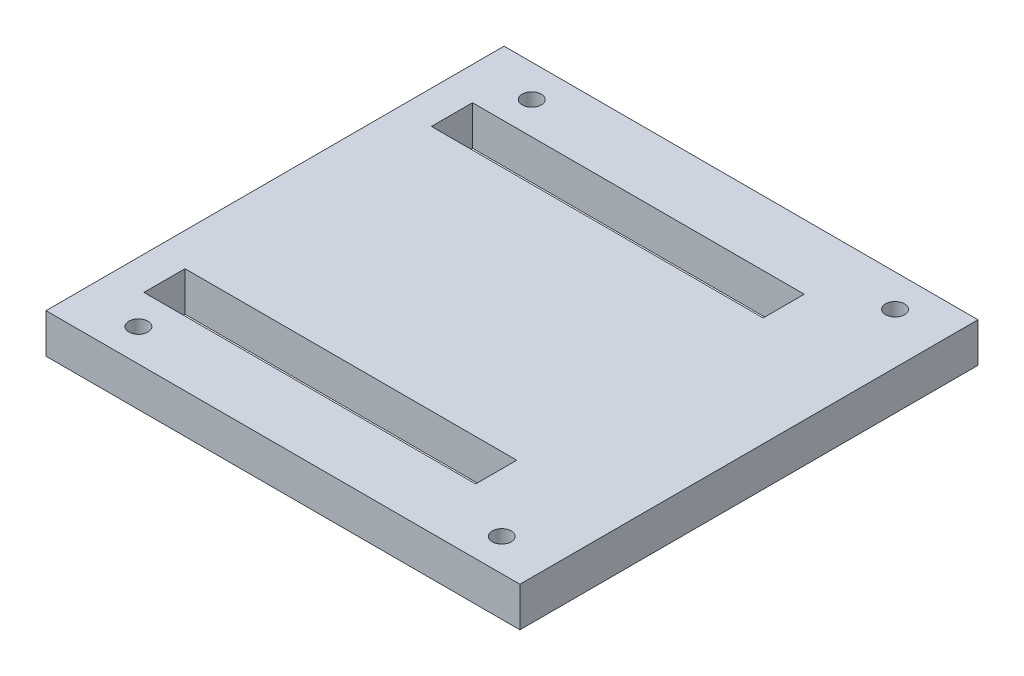
ISO-10303-21;
HEADER;
FILE_DESCRIPTION(('STEP AP214'),'2;1');
FILE_NAME('part.step','',(''),(''),'','','');
FILE_SCHEMA(('AUTOMOTIVE_DESIGN { 1 0 10303 214 1 1 1 1 }'));
ENDSEC;
DATA;
#1=APPLICATION_CONTEXT('core data for automotive mechanical design processes');
#2=APPLICATION_PROTOCOL_DEFINITION('international standard','automotive_design',2000,#1);
#3=PRODUCT_CONTEXT('',#1,'mechanical');
#4=PRODUCT('Part','Part','',(#3));
#5=PRODUCT_RELATED_PRODUCT_CATEGORY('part','',(#4));
#6=PRODUCT_DEFINITION_FORMATION('','',#4);
#7=PRODUCT_DEFINITION_CONTEXT('part definition',#1,'design');
#8=PRODUCT_DEFINITION('design','',#6,#7);
#9=PRODUCT_DEFINITION_SHAPE('','',#8);
#10=(LENGTH_UNIT() NAMED_UNIT(*) SI_UNIT(.MILLI.,.METRE.));
#11=(NAMED_UNIT(*) PLANE_ANGLE_UNIT() SI_UNIT($,.RADIAN.));
#12=(NAMED_UNIT(*) SI_UNIT($,.STERADIAN.) SOLID_ANGLE_UNIT());
#13=UNCERTAINTY_MEASURE_WITH_UNIT(LENGTH_MEASURE(1.E-05),#10,'distance_accuracy_value','');
#14=(GEOMETRIC_REPRESENTATION_CONTEXT(3) GLOBAL_UNCERTAINTY_ASSIGNED_CONTEXT((#13)) GLOBAL_UNIT_ASSIGNED_CONTEXT((#10,
#11,#12)) REPRESENTATION_CONTEXT('',''));
#15=CARTESIAN_POINT('',(0.,0.,0.));
#16=DIRECTION('',(0.,0.,1.));
#17=DIRECTION('',(1.,0.,0.));
#18=AXIS2_PLACEMENT_3D('',#15,#16,#17);
#19=CARTESIAN_POINT('',(11.8,2.5,12.45));
#20=DIRECTION('',(0.,-1.,0.));
#21=DIRECTION('',(0.,0.,-1.));
#22=AXIS2_PLACEMENT_3D('',#19,#20,#21);
#23=CYLINDRICAL_SURFACE('',#22,0.6);
#24=CARTESIAN_POINT('',(11.8,2.5,12.45));
#25=DIRECTION('',(0.,-1.,0.));
#26=DIRECTION('',(0.,0.,-1.));
#27=AXIS2_PLACEMENT_3D('',#24,#25,#26);
#28=CIRCLE('',#27,0.6);
#29=CARTESIAN_POINT('',(11.8,2.5,11.85));
#30=VERTEX_POINT('',#29);
#31=EDGE_CURVE('E157',#30,#30,#28,.T.);
#32=ORIENTED_EDGE('',*,*,#31,.F.);
#33=EDGE_LOOP('',(#32));
#34=FACE_BOUND('',#33,.T.);
#35=CARTESIAN_POINT('',(11.8,1.5,12.45));
#36=DIRECTION('',(0.,-1.,0.));
#37=DIRECTION('',(0.,0.,-1.));
#38=AXIS2_PLACEMENT_3D('',#35,#36,#37);
#39=CIRCLE('',#38,0.6);
#40=CARTESIAN_POINT('',(11.8,1.5,11.85));
#41=VERTEX_POINT('',#40);
#42=EDGE_CURVE('E472',#41,#41,#39,.T.);
#43=ORIENTED_EDGE('',*,*,#42,.T.);
#44=EDGE_LOOP('',(#43));
#45=FACE_BOUND('',#44,.T.);
#46=ADVANCED_FACE('F39',(#34,#45),#23,.F.);
#47=CARTESIAN_POINT('',(11.8,2.5,-12.45));
#48=DIRECTION('',(0.,-1.,0.));
#49=DIRECTION('',(0.,0.,-1.));
#50=AXIS2_PLACEMENT_3D('',#47,#48,#49);
#51=CYLINDRICAL_SURFACE('',#50,0.6);
#52=CARTESIAN_POINT('',(11.8,2.5,-12.45));
#53=DIRECTION('',(0.,-1.,0.));
#54=DIRECTION('',(0.,0.,-1.));
#55=AXIS2_PLACEMENT_3D('',#52,#53,#54);
#56=CIRCLE('',#55,0.6);
#57=CARTESIAN_POINT('',(11.8,2.5,-13.05));
#58=VERTEX_POINT('',#57);
#59=EDGE_CURVE('E507',#58,#58,#56,.T.);
#60=ORIENTED_EDGE('',*,*,#59,.F.);
#61=EDGE_LOOP('',(#60));
#62=FACE_BOUND('',#61,.T.);
#63=CARTESIAN_POINT('',(11.8,1.5,-12.45));
#64=DIRECTION('',(0.,-1.,0.));
#65=DIRECTION('',(0.,0.,-1.));
#66=AXIS2_PLACEMENT_3D('',#63,#64,#65);
#67=CIRCLE('',#66,0.6);
#68=CARTESIAN_POINT('',(11.8,1.5,-13.05));
#69=VERTEX_POINT('',#68);
#70=EDGE_CURVE('E487',#69,#69,#67,.T.);
#71=ORIENTED_EDGE('',*,*,#70,.T.);
#72=EDGE_LOOP('',(#71));
#73=FACE_BOUND('',#72,.T.);
#74=ADVANCED_FACE('F249',(#62,#73),#51,.F.);
#75=CARTESIAN_POINT('',(-11.2,2.5,-12.45));
#76=DIRECTION('',(0.,-1.,0.));
#77=DIRECTION('',(0.,0.,-1.));
#78=AXIS2_PLACEMENT_3D('',#75,#76,#77);
#79=CYLINDRICAL_SURFACE('',#78,0.6);
#80=CARTESIAN_POINT('',(-11.2,2.5,-12.45));
#81=DIRECTION('',(0.,-1.,0.));
#82=DIRECTION('',(0.,0.,-1.));
#83=AXIS2_PLACEMENT_3D('',#80,#81,#82);
#84=CIRCLE('',#83,0.6);
#85=CARTESIAN_POINT('',(-11.2,2.5,-13.05));
#86=VERTEX_POINT('',#85);
#87=EDGE_CURVE('E510',#86,#86,#84,.T.);
#88=ORIENTED_EDGE('',*,*,#87,.F.);
#89=EDGE_LOOP('',(#88));
#90=FACE_BOUND('',#89,.T.);
#91=CARTESIAN_POINT('',(-11.2,1.5,-12.45));
#92=DIRECTION('',(0.,-1.,0.));
#93=DIRECTION('',(0.,0.,-1.));
#94=AXIS2_PLACEMENT_3D('',#91,#92,#93);
#95=CIRCLE('',#94,0.6);
#96=CARTESIAN_POINT('',(-11.2,1.5,-13.05));
#97=VERTEX_POINT('',#96);
#98=EDGE_CURVE('E496',#97,#97,#95,.T.);
#99=ORIENTED_EDGE('',*,*,#98,.T.);
#100=EDGE_LOOP('',(#99));
#101=FACE_BOUND('',#100,.T.);
#102=ADVANCED_FACE('F256',(#90,#101),#79,.F.);
#103=CARTESIAN_POINT('',(-11.2,2.5,12.45));
#104=DIRECTION('',(0.,-1.,0.));
#105=DIRECTION('',(0.,0.,-1.));
#106=AXIS2_PLACEMENT_3D('',#103,#104,#105);
#107=CYLINDRICAL_SURFACE('',#106,0.6);
#108=CARTESIAN_POINT('',(-11.2,2.5,12.45));
#109=DIRECTION('',(0.,-1.,0.));
#110=DIRECTION('',(0.,0.,-1.));
#111=AXIS2_PLACEMENT_3D('',#108,#109,#110);
#112=CIRCLE('',#111,0.6);
#113=CARTESIAN_POINT('',(-11.2,2.5,11.85));
#114=VERTEX_POINT('',#113);
#115=EDGE_CURVE('E504',#114,#114,#112,.T.);
#116=ORIENTED_EDGE('',*,*,#115,.F.);
#117=EDGE_LOOP('',(#116));
#118=FACE_BOUND('',#117,.T.);
#119=CARTESIAN_POINT('',(-11.2,1.5,12.45));
#120=DIRECTION('',(0.,-1.,0.));
#121=DIRECTION('',(0.,0.,-1.));
#122=AXIS2_PLACEMENT_3D('',#119,#120,#121);
#123=CIRCLE('',#122,0.6);
#124=CARTESIAN_POINT('',(-11.2,1.5,11.85));
#125=VERTEX_POINT('',#124);
#126=EDGE_CURVE('E476',#125,#125,#123,.T.);
#127=ORIENTED_EDGE('',*,*,#126,.T.);
#128=EDGE_LOOP('',(#127));
#129=FACE_BOUND('',#128,.T.);
#130=ADVANCED_FACE('F263',(#118,#129),#107,.F.);
#131=CARTESIAN_POINT('',(0.,2.5,0.));
#132=DIRECTION('',(0.,-1.,0.));
#133=DIRECTION('',(0.,0.,-1.));
#134=AXIS2_PLACEMENT_3D('',#131,#132,#133);
#135=PLANE('',#134);
#136=ORIENTED_EDGE('',*,*,#115,.T.);
#137=EDGE_LOOP('',(#136));
#138=FACE_BOUND('',#137,.T.);
#139=ORIENTED_EDGE('',*,*,#87,.T.);
#140=EDGE_LOOP('',(#139));
#141=FACE_BOUND('',#140,.T.);
#142=ORIENTED_EDGE('',*,*,#59,.T.);
#143=EDGE_LOOP('',(#142));
#144=FACE_BOUND('',#143,.T.);
#145=ORIENTED_EDGE('',*,*,#31,.T.);
#146=EDGE_LOOP('',(#145));
#147=FACE_BOUND('',#146,.T.);
#148=DIRECTION('',(0.,0.,1.));
#149=VECTOR('',#148,1.);
#150=CARTESIAN_POINT('',(-12.9,2.5,-10.4));
#151=LINE('',#150,#149);
#152=CARTESIAN_POINT('',(-12.9,2.5,-10.4));
#153=VERTEX_POINT('',#152);
#154=CARTESIAN_POINT('',(-12.9,2.5,-7.80000000000001));
#155=VERTEX_POINT('',#154);
#156=EDGE_CURVE('E167',#153,#155,#151,.T.);
#157=ORIENTED_EDGE('',*,*,#156,.F.);
#158=DIRECTION('',(-1.,0.,0.));
#159=VECTOR('',#158,1.);
#160=CARTESIAN_POINT('',(-12.9,2.5,-10.4));
#161=LINE('',#160,#159);
#162=CARTESIAN_POINT('',(8.1,2.5,-10.4));
#163=VERTEX_POINT('',#162);
#164=EDGE_CURVE('E175',#163,#153,#161,.T.);
#165=ORIENTED_EDGE('',*,*,#164,.F.);
#166=DIRECTION('',(0.,0.,-1.));
#167=VECTOR('',#166,1.);
#168=CARTESIAN_POINT('',(8.1,2.5,-10.4));
#169=LINE('',#168,#167);
#170=CARTESIAN_POINT('',(8.1,2.5,-7.80000000000001));
#171=VERTEX_POINT('',#170);
#172=EDGE_CURVE('E172',#171,#163,#169,.T.);
#173=ORIENTED_EDGE('',*,*,#172,.F.);
#174=DIRECTION('',(1.,0.,0.));
#175=VECTOR('',#174,1.);
#176=CARTESIAN_POINT('',(-12.9,2.5,-7.80000000000001));
#177=LINE('',#176,#175);
#178=EDGE_CURVE('E169',#155,#171,#177,.T.);
#179=ORIENTED_EDGE('',*,*,#178,.F.);
#180=EDGE_LOOP('',(#157,#165,#173,#179));
#181=FACE_BOUND('',#180,.T.);
#182=DIRECTION('',(0.,0.,-1.));
#183=VECTOR('',#182,1.);
#184=CARTESIAN_POINT('',(15.,2.5,14.5));
#185=LINE('',#184,#183);
#186=CARTESIAN_POINT('',(15.,2.5,14.5));
#187=VERTEX_POINT('',#186);
#188=CARTESIAN_POINT('',(15.,2.5,-14.5));
#189=VERTEX_POINT('',#188);
#190=EDGE_CURVE('E198',#187,#189,#185,.T.);
#191=ORIENTED_EDGE('',*,*,#190,.T.);
#192=DIRECTION('',(-1.,0.,0.));
#193=VECTOR('',#192,1.);
#194=CARTESIAN_POINT('',(-15.,2.5,-14.5));
#195=LINE('',#194,#193);
#196=CARTESIAN_POINT('',(-15.,2.5,-14.5));
#197=VERTEX_POINT('',#196);
#198=EDGE_CURVE('E201',#189,#197,#195,.T.);
#199=ORIENTED_EDGE('',*,*,#198,.T.);
#200=DIRECTION('',(0.,0.,1.));
#201=VECTOR('',#200,1.);
#202=CARTESIAN_POINT('',(-15.,2.5,14.5));
#203=LINE('',#202,#201);
#204=CARTESIAN_POINT('',(-15.,2.5,14.5));
#205=VERTEX_POINT('',#204);
#206=EDGE_CURVE('E204',#197,#205,#203,.T.);
#207=ORIENTED_EDGE('',*,*,#206,.T.);
#208=DIRECTION('',(1.,0.,0.));
#209=VECTOR('',#208,1.);
#210=CARTESIAN_POINT('',(-15.,2.5,14.5));
#211=LINE('',#210,#209);
#212=EDGE_CURVE('E206',#205,#187,#211,.T.);
#213=ORIENTED_EDGE('',*,*,#212,.T.);
#214=EDGE_LOOP('',(#191,#199,#207,#213));
#215=FACE_BOUND('',#214,.T.);
#216=DIRECTION('',(0.,0.,1.));
#217=VECTOR('',#216,1.);
#218=CARTESIAN_POINT('',(-12.9,2.5,7.79999999999999));
#219=LINE('',#218,#217);
#220=CARTESIAN_POINT('',(-12.9,2.5,7.79999999999999));
#221=VERTEX_POINT('',#220);
#222=CARTESIAN_POINT('',(-12.9,2.5,10.4));
#223=VERTEX_POINT('',#222);
#224=EDGE_CURVE('E128',#221,#223,#219,.T.);
#225=ORIENTED_EDGE('',*,*,#224,.F.);
#226=DIRECTION('',(-1.,0.,0.));
#227=VECTOR('',#226,1.);
#228=CARTESIAN_POINT('',(-12.9,2.5,7.79999999999999));
#229=LINE('',#228,#227);
#230=CARTESIAN_POINT('',(8.1,2.5,7.79999999999999));
#231=VERTEX_POINT('',#230);
#232=EDGE_CURVE('E151',#231,#221,#229,.T.);
#233=ORIENTED_EDGE('',*,*,#232,.F.);
#234=DIRECTION('',(0.,0.,-1.));
#235=VECTOR('',#234,1.);
#236=CARTESIAN_POINT('',(8.1,2.5,7.79999999999999));
#237=LINE('',#236,#235);
#238=CARTESIAN_POINT('',(8.1,2.5,10.4));
#239=VERTEX_POINT('',#238);
#240=EDGE_CURVE('E149',#239,#231,#237,.T.);
#241=ORIENTED_EDGE('',*,*,#240,.F.);
#242=DIRECTION('',(1.,0.,0.));
#243=VECTOR('',#242,1.);
#244=CARTESIAN_POINT('',(-12.9,2.5,10.4));
#245=LINE('',#244,#243);
#246=EDGE_CURVE('E136',#223,#239,#245,.T.);
#247=ORIENTED_EDGE('',*,*,#246,.F.);
#248=EDGE_LOOP('',(#225,#233,#241,#247));
#249=FACE_BOUND('',#248,.T.);
#250=ADVANCED_FACE('F148',(#138,#141,#144,#147,#181,#215,#249),#135,.F.);
#251=CARTESIAN_POINT('',(0.,0.,0.));
#252=DIRECTION('',(0.,-1.,0.));
#253=DIRECTION('',(0.,0.,-1.));
#254=AXIS2_PLACEMENT_3D('',#251,#252,#253);
#255=PLANE('',#254);
#256=CARTESIAN_POINT('',(11.8,0.,-12.45));
#257=DIRECTION('',(0.,-1.,0.));
#258=DIRECTION('',(0.,0.,-1.));
#259=AXIS2_PLACEMENT_3D('',#256,#257,#258);
#260=CIRCLE('',#259,1.);
#261=CARTESIAN_POINT('',(11.8,0.,-13.45));
#262=VERTEX_POINT('',#261);
#263=EDGE_CURVE('E490',#262,#262,#260,.T.);
#264=ORIENTED_EDGE('',*,*,#263,.F.);
#265=EDGE_LOOP('',(#264));
#266=FACE_BOUND('',#265,.T.);
#267=CARTESIAN_POINT('',(11.8,0.,12.45));
#268=DIRECTION('',(0.,-1.,0.));
#269=DIRECTION('',(0.,0.,-1.));
#270=AXIS2_PLACEMENT_3D('',#267,#268,#269);
#271=CIRCLE('',#270,1.);
#272=CARTESIAN_POINT('',(11.8,0.,11.45));
#273=VERTEX_POINT('',#272);
#274=EDGE_CURVE('E477',#273,#273,#271,.T.);
#275=ORIENTED_EDGE('',*,*,#274,.F.);
#276=EDGE_LOOP('',(#275));
#277=FACE_BOUND('',#276,.T.);
#278=CARTESIAN_POINT('',(-11.2,0.,12.45));
#279=DIRECTION('',(0.,-1.,0.));
#280=DIRECTION('',(0.,0.,-1.));
#281=AXIS2_PLACEMENT_3D('',#278,#279,#280);
#282=CIRCLE('',#281,1.);
#283=CARTESIAN_POINT('',(-11.2,0.,11.45));
#284=VERTEX_POINT('',#283);
#285=EDGE_CURVE('E480',#284,#284,#282,.T.);
#286=ORIENTED_EDGE('',*,*,#285,.F.);
#287=EDGE_LOOP('',(#286));
#288=FACE_BOUND('',#287,.T.);
#289=CARTESIAN_POINT('',(-11.2,0.,-12.45));
#290=DIRECTION('',(0.,-1.,0.));
#291=DIRECTION('',(0.,0.,-1.));
#292=AXIS2_PLACEMENT_3D('',#289,#290,#291);
#293=CIRCLE('',#292,1.);
#294=CARTESIAN_POINT('',(-11.2,0.,-13.45));
#295=VERTEX_POINT('',#294);
#296=EDGE_CURVE('E499',#295,#295,#293,.T.);
#297=ORIENTED_EDGE('',*,*,#296,.F.);
#298=EDGE_LOOP('',(#297));
#299=FACE_BOUND('',#298,.T.);
#300=DIRECTION('',(0.,0.,-1.));
#301=VECTOR('',#300,1.);
#302=CARTESIAN_POINT('',(15.,0.,14.5));
#303=LINE('',#302,#301);
#304=CARTESIAN_POINT('',(15.,0.,14.5));
#305=VERTEX_POINT('',#304);
#306=CARTESIAN_POINT('',(15.,0.,-14.5));
#307=VERTEX_POINT('',#306);
#308=EDGE_CURVE('E197',#305,#307,#303,.T.);
#309=ORIENTED_EDGE('',*,*,#308,.F.);
#310=DIRECTION('',(1.,0.,0.));
#311=VECTOR('',#310,1.);
#312=CARTESIAN_POINT('',(-15.,0.,14.5));
#313=LINE('',#312,#311);
#314=CARTESIAN_POINT('',(-15.,0.,14.5));
#315=VERTEX_POINT('',#314);
#316=EDGE_CURVE('E202',#315,#305,#313,.T.);
#317=ORIENTED_EDGE('',*,*,#316,.F.);
#318=DIRECTION('',(0.,0.,1.));
#319=VECTOR('',#318,1.);
#320=CARTESIAN_POINT('',(-15.,0.,14.5));
#321=LINE('',#320,#319);
#322=CARTESIAN_POINT('',(-15.,0.,-14.5));
#323=VERTEX_POINT('',#322);
#324=EDGE_CURVE('E213',#323,#315,#321,.T.);
#325=ORIENTED_EDGE('',*,*,#324,.F.);
#326=DIRECTION('',(-1.,0.,0.));
#327=VECTOR('',#326,1.);
#328=CARTESIAN_POINT('',(-15.,0.,-14.5));
#329=LINE('',#328,#327);
#330=EDGE_CURVE('E211',#307,#323,#329,.T.);
#331=ORIENTED_EDGE('',*,*,#330,.F.);
#332=EDGE_LOOP('',(#309,#317,#325,#331));
#333=FACE_BOUND('',#332,.T.);
#334=DIRECTION('',(-1.,0.,0.));
#335=VECTOR('',#334,1.);
#336=CARTESIAN_POINT('',(-12.9,0.,-10.4));
#337=LINE('',#336,#335);
#338=CARTESIAN_POINT('',(8.1,0.,-10.4));
#339=VERTEX_POINT('',#338);
#340=CARTESIAN_POINT('',(-12.9,0.,-10.4));
#341=VERTEX_POINT('',#340);
#342=EDGE_CURVE('E170',#339,#341,#337,.T.);
#343=ORIENTED_EDGE('',*,*,#342,.T.);
#344=DIRECTION('',(0.,0.,1.));
#345=VECTOR('',#344,1.);
#346=CARTESIAN_POINT('',(-12.9,0.,-10.4));
#347=LINE('',#346,#345);
#348=CARTESIAN_POINT('',(-12.9,0.,-7.80000000000001));
#349=VERTEX_POINT('',#348);
#350=EDGE_CURVE('E144',#341,#349,#347,.T.);
#351=ORIENTED_EDGE('',*,*,#350,.T.);
#352=DIRECTION('',(1.,0.,0.));
#353=VECTOR('',#352,1.);
#354=CARTESIAN_POINT('',(-12.9,0.,-7.80000000000001));
#355=LINE('',#354,#353);
#356=CARTESIAN_POINT('',(8.1,0.,-7.80000000000001));
#357=VERTEX_POINT('',#356);
#358=EDGE_CURVE('E180',#349,#357,#355,.T.);
#359=ORIENTED_EDGE('',*,*,#358,.T.);
#360=DIRECTION('',(0.,0.,-1.));
#361=VECTOR('',#360,1.);
#362=CARTESIAN_POINT('',(8.1,0.,-10.4));
#363=LINE('',#362,#361);
#364=EDGE_CURVE('E183',#357,#339,#363,.T.);
#365=ORIENTED_EDGE('',*,*,#364,.T.);
#366=EDGE_LOOP('',(#343,#351,#359,#365));
#367=FACE_BOUND('',#366,.T.);
#368=DIRECTION('',(-1.,0.,0.));
#369=VECTOR('',#368,1.);
#370=CARTESIAN_POINT('',(-12.9,0.,7.79999999999999));
#371=LINE('',#370,#369);
#372=CARTESIAN_POINT('',(8.1,0.,7.79999999999999));
#373=VERTEX_POINT('',#372);
#374=CARTESIAN_POINT('',(-12.9,0.,7.79999999999999));
#375=VERTEX_POINT('',#374);
#376=EDGE_CURVE('E137',#373,#375,#371,.T.);
#377=ORIENTED_EDGE('',*,*,#376,.T.);
#378=DIRECTION('',(0.,0.,1.));
#379=VECTOR('',#378,1.);
#380=CARTESIAN_POINT('',(-12.9,0.,7.79999999999999));
#381=LINE('',#380,#379);
#382=CARTESIAN_POINT('',(-12.9,0.,10.4));
#383=VERTEX_POINT('',#382);
#384=EDGE_CURVE('E62',#375,#383,#381,.T.);
#385=ORIENTED_EDGE('',*,*,#384,.T.);
#386=DIRECTION('',(1.,0.,0.));
#387=VECTOR('',#386,1.);
#388=CARTESIAN_POINT('',(-12.9,0.,10.4));
#389=LINE('',#388,#387);
#390=CARTESIAN_POINT('',(8.1,0.,10.4));
#391=VERTEX_POINT('',#390);
#392=EDGE_CURVE('E143',#383,#391,#389,.T.);
#393=ORIENTED_EDGE('',*,*,#392,.T.);
#394=DIRECTION('',(0.,0.,-1.));
#395=VECTOR('',#394,1.);
#396=CARTESIAN_POINT('',(8.1,0.,7.79999999999999));
#397=LINE('',#396,#395);
#398=EDGE_CURVE('E159',#391,#373,#397,.T.);
#399=ORIENTED_EDGE('',*,*,#398,.T.);
#400=EDGE_LOOP('',(#377,#385,#393,#399));
#401=FACE_BOUND('',#400,.T.);
#402=ADVANCED_FACE('F231',(#266,#277,#288,#299,#333,#367,#401),#255,.T.);
#403=CARTESIAN_POINT('',(15.,2.5,14.5));
#404=DIRECTION('',(-1.,0.,0.));
#405=DIRECTION('',(0.,0.,1.));
#406=AXIS2_PLACEMENT_3D('',#403,#404,#405);
#407=PLANE('',#406);
#408=ORIENTED_EDGE('',*,*,#308,.T.);
#409=DIRECTION('',(0.,-1.,0.));
#410=VECTOR('',#409,1.);
#411=CARTESIAN_POINT('',(15.,2.5,-14.5));
#412=LINE('',#411,#410);
#413=EDGE_CURVE('E11',#189,#307,#412,.T.);
#414=ORIENTED_EDGE('',*,*,#413,.F.);
#415=ORIENTED_EDGE('',*,*,#190,.F.);
#416=DIRECTION('',(0.,-1.,0.));
#417=VECTOR('',#416,1.);
#418=CARTESIAN_POINT('',(15.,2.5,14.5));
#419=LINE('',#418,#417);
#420=EDGE_CURVE('E208',#187,#305,#419,.T.);
#421=ORIENTED_EDGE('',*,*,#420,.T.);
#422=EDGE_LOOP('',(#408,#414,#415,#421));
#423=FACE_BOUND('',#422,.T.);
#424=ADVANCED_FACE('F41',(#423),#407,.F.);
#425=CARTESIAN_POINT('',(-15.,2.5,-14.5));
#426=DIRECTION('',(0.,0.,1.));
#427=DIRECTION('',(1.,0.,0.));
#428=AXIS2_PLACEMENT_3D('',#425,#426,#427);
#429=PLANE('',#428);
#430=ORIENTED_EDGE('',*,*,#330,.T.);
#431=DIRECTION('',(0.,-1.,0.));
#432=VECTOR('',#431,1.);
#433=CARTESIAN_POINT('',(-15.,2.5,-14.5));
#434=LINE('',#433,#432);
#435=EDGE_CURVE('E47',#197,#323,#434,.T.);
#436=ORIENTED_EDGE('',*,*,#435,.F.);
#437=ORIENTED_EDGE('',*,*,#198,.F.);
#438=ORIENTED_EDGE('',*,*,#413,.T.);
#439=EDGE_LOOP('',(#430,#436,#437,#438));
#440=FACE_BOUND('',#439,.T.);
#441=ADVANCED_FACE('F241',(#440),#429,.F.);
#442=CARTESIAN_POINT('',(-15.,2.5,14.5));
#443=DIRECTION('',(1.,0.,0.));
#444=DIRECTION('',(0.,0.,-1.));
#445=AXIS2_PLACEMENT_3D('',#442,#443,#444);
#446=PLANE('',#445);
#447=ORIENTED_EDGE('',*,*,#324,.T.);
#448=DIRECTION('',(0.,-1.,0.));
#449=VECTOR('',#448,1.);
#450=CARTESIAN_POINT('',(-15.,2.5,14.5));
#451=LINE('',#450,#449);
#452=EDGE_CURVE('E218',#205,#315,#451,.T.);
#453=ORIENTED_EDGE('',*,*,#452,.F.);
#454=ORIENTED_EDGE('',*,*,#206,.F.);
#455=ORIENTED_EDGE('',*,*,#435,.T.);
#456=EDGE_LOOP('',(#447,#453,#454,#455));
#457=FACE_BOUND('',#456,.T.);
#458=ADVANCED_FACE('F225',(#457),#446,.F.);
#459=CARTESIAN_POINT('',(-15.,2.5,14.5));
#460=DIRECTION('',(0.,0.,-1.));
#461=DIRECTION('',(-1.,0.,0.));
#462=AXIS2_PLACEMENT_3D('',#459,#460,#461);
#463=PLANE('',#462);
#464=ORIENTED_EDGE('',*,*,#316,.T.);
#465=ORIENTED_EDGE('',*,*,#420,.F.);
#466=ORIENTED_EDGE('',*,*,#212,.F.);
#467=ORIENTED_EDGE('',*,*,#452,.T.);
#468=EDGE_LOOP('',(#464,#465,#466,#467));
#469=FACE_BOUND('',#468,.T.);
#470=ADVANCED_FACE('F235',(#469),#463,.F.);
#471=CARTESIAN_POINT('',(-12.9,2.5,-10.4));
#472=DIRECTION('',(1.,0.,0.));
#473=DIRECTION('',(0.,0.,-1.));
#474=AXIS2_PLACEMENT_3D('',#471,#472,#473);
#475=PLANE('',#474);
#476=ORIENTED_EDGE('',*,*,#350,.F.);
#477=DIRECTION('',(0.,-1.,0.));
#478=VECTOR('',#477,1.);
#479=CARTESIAN_POINT('',(-12.9,2.5,-10.4));
#480=LINE('',#479,#478);
#481=EDGE_CURVE('E177',#153,#341,#480,.T.);
#482=ORIENTED_EDGE('',*,*,#481,.F.);
#483=ORIENTED_EDGE('',*,*,#156,.T.);
#484=DIRECTION('',(0.,-1.,0.));
#485=VECTOR('',#484,1.);
#486=CARTESIAN_POINT('',(-12.9,2.5,-7.80000000000001));
#487=LINE('',#486,#485);
#488=EDGE_CURVE('E194',#155,#349,#487,.T.);
#489=ORIENTED_EDGE('',*,*,#488,.T.);
#490=EDGE_LOOP('',(#476,#482,#483,#489));
#491=FACE_BOUND('',#490,.T.);
#492=ADVANCED_FACE('F287',(#491),#475,.T.);
#493=CARTESIAN_POINT('',(-12.9,2.5,-7.80000000000001));
#494=DIRECTION('',(0.,0.,-1.));
#495=DIRECTION('',(-1.,0.,0.));
#496=AXIS2_PLACEMENT_3D('',#493,#494,#495);
#497=PLANE('',#496);
#498=ORIENTED_EDGE('',*,*,#358,.F.);
#499=ORIENTED_EDGE('',*,*,#488,.F.);
#500=ORIENTED_EDGE('',*,*,#178,.T.);
#501=DIRECTION('',(0.,-1.,0.));
#502=VECTOR('',#501,1.);
#503=CARTESIAN_POINT('',(8.1,2.5,-7.80000000000001));
#504=LINE('',#503,#502);
#505=EDGE_CURVE('E192',#171,#357,#504,.T.);
#506=ORIENTED_EDGE('',*,*,#505,.T.);
#507=EDGE_LOOP('',(#498,#499,#500,#506));
#508=FACE_BOUND('',#507,.T.);
#509=ADVANCED_FACE('F283',(#508),#497,.T.);
#510=CARTESIAN_POINT('',(8.1,2.5,-10.4));
#511=DIRECTION('',(-1.,0.,0.));
#512=DIRECTION('',(0.,0.,1.));
#513=AXIS2_PLACEMENT_3D('',#510,#511,#512);
#514=PLANE('',#513);
#515=ORIENTED_EDGE('',*,*,#364,.F.);
#516=ORIENTED_EDGE('',*,*,#505,.F.);
#517=ORIENTED_EDGE('',*,*,#172,.T.);
#518=DIRECTION('',(0.,-1.,0.));
#519=VECTOR('',#518,1.);
#520=CARTESIAN_POINT('',(8.1,2.5,-10.4));
#521=LINE('',#520,#519);
#522=EDGE_CURVE('E190',#163,#339,#521,.T.);
#523=ORIENTED_EDGE('',*,*,#522,.T.);
#524=EDGE_LOOP('',(#515,#516,#517,#523));
#525=FACE_BOUND('',#524,.T.);
#526=ADVANCED_FACE('F279',(#525),#514,.T.);
#527=CARTESIAN_POINT('',(-12.9,2.5,-10.4));
#528=DIRECTION('',(0.,0.,1.));
#529=DIRECTION('',(1.,0.,0.));
#530=AXIS2_PLACEMENT_3D('',#527,#528,#529);
#531=PLANE('',#530);
#532=ORIENTED_EDGE('',*,*,#342,.F.);
#533=ORIENTED_EDGE('',*,*,#522,.F.);
#534=ORIENTED_EDGE('',*,*,#164,.T.);
#535=ORIENTED_EDGE('',*,*,#481,.T.);
#536=EDGE_LOOP('',(#532,#533,#534,#535));
#537=FACE_BOUND('',#536,.T.);
#538=ADVANCED_FACE('F276',(#537),#531,.T.);
#539=CARTESIAN_POINT('',(-12.9,2.5,7.79999999999999));
#540=DIRECTION('',(1.,0.,0.));
#541=DIRECTION('',(0.,0.,-1.));
#542=AXIS2_PLACEMENT_3D('',#539,#540,#541);
#543=PLANE('',#542);
#544=ORIENTED_EDGE('',*,*,#384,.F.);
#545=DIRECTION('',(0.,-1.,0.));
#546=VECTOR('',#545,1.);
#547=CARTESIAN_POINT('',(-12.9,2.5,7.79999999999999));
#548=LINE('',#547,#546);
#549=EDGE_CURVE('E132',#221,#375,#548,.T.);
#550=ORIENTED_EDGE('',*,*,#549,.F.);
#551=ORIENTED_EDGE('',*,*,#224,.T.);
#552=DIRECTION('',(0.,-1.,0.));
#553=VECTOR('',#552,1.);
#554=CARTESIAN_POINT('',(-12.9,2.5,10.4));
#555=LINE('',#554,#553);
#556=EDGE_CURVE('E131',#223,#383,#555,.T.);
#557=ORIENTED_EDGE('',*,*,#556,.T.);
#558=EDGE_LOOP('',(#544,#550,#551,#557));
#559=FACE_BOUND('',#558,.T.);
#560=ADVANCED_FACE('F130',(#559),#543,.T.);
#561=CARTESIAN_POINT('',(-12.9,2.5,10.4));
#562=DIRECTION('',(0.,0.,-1.));
#563=DIRECTION('',(-1.,0.,0.));
#564=AXIS2_PLACEMENT_3D('',#561,#562,#563);
#565=PLANE('',#564);
#566=ORIENTED_EDGE('',*,*,#392,.F.);
#567=ORIENTED_EDGE('',*,*,#556,.F.);
#568=ORIENTED_EDGE('',*,*,#246,.T.);
#569=DIRECTION('',(0.,-1.,0.));
#570=VECTOR('',#569,1.);
#571=CARTESIAN_POINT('',(8.1,2.5,10.4));
#572=LINE('',#571,#570);
#573=EDGE_CURVE('E145',#239,#391,#572,.T.);
#574=ORIENTED_EDGE('',*,*,#573,.T.);
#575=EDGE_LOOP('',(#566,#567,#568,#574));
#576=FACE_BOUND('',#575,.T.);
#577=ADVANCED_FACE('F140',(#576),#565,.T.);
#578=CARTESIAN_POINT('',(8.1,2.5,7.79999999999999));
#579=DIRECTION('',(-1.,0.,0.));
#580=DIRECTION('',(0.,0.,1.));
#581=AXIS2_PLACEMENT_3D('',#578,#579,#580);
#582=PLANE('',#581);
#583=ORIENTED_EDGE('',*,*,#398,.F.);
#584=ORIENTED_EDGE('',*,*,#573,.F.);
#585=ORIENTED_EDGE('',*,*,#240,.T.);
#586=DIRECTION('',(0.,-1.,0.));
#587=VECTOR('',#586,1.);
#588=CARTESIAN_POINT('',(8.1,2.5,7.79999999999999));
#589=LINE('',#588,#587);
#590=EDGE_CURVE('E54',#231,#373,#589,.T.);
#591=ORIENTED_EDGE('',*,*,#590,.T.);
#592=EDGE_LOOP('',(#583,#584,#585,#591));
#593=FACE_BOUND('',#592,.T.);
#594=ADVANCED_FACE('F268',(#593),#582,.T.);
#595=CARTESIAN_POINT('',(-12.9,2.5,7.79999999999999));
#596=DIRECTION('',(0.,0.,1.));
#597=DIRECTION('',(1.,0.,0.));
#598=AXIS2_PLACEMENT_3D('',#595,#596,#597);
#599=PLANE('',#598);
#600=ORIENTED_EDGE('',*,*,#376,.F.);
#601=ORIENTED_EDGE('',*,*,#590,.F.);
#602=ORIENTED_EDGE('',*,*,#232,.T.);
#603=ORIENTED_EDGE('',*,*,#549,.T.);
#604=EDGE_LOOP('',(#600,#601,#602,#603));
#605=FACE_BOUND('',#604,.T.);
#606=ADVANCED_FACE('F265',(#605),#599,.T.);
#607=CARTESIAN_POINT('',(-11.2,1.5,12.45));
#608=DIRECTION('',(0.,-1.,0.));
#609=DIRECTION('',(0.,0.,-1.));
#610=AXIS2_PLACEMENT_3D('',#607,#608,#609);
#611=CYLINDRICAL_SURFACE('',#610,1.);
#612=CARTESIAN_POINT('',(-11.2,1.5,12.45));
#613=DIRECTION('',(0.,-1.,0.));
#614=DIRECTION('',(0.,0.,-1.));
#615=AXIS2_PLACEMENT_3D('',#612,#613,#614);
#616=CIRCLE('',#615,1.);
#617=CARTESIAN_POINT('',(-11.2,1.5,11.45));
#618=VERTEX_POINT('',#617);
#619=EDGE_CURVE('E500',#618,#618,#616,.T.);
#620=ORIENTED_EDGE('',*,*,#619,.F.);
#621=EDGE_LOOP('',(#620));
#622=FACE_BOUND('',#621,.T.);
#623=ORIENTED_EDGE('',*,*,#285,.T.);
#624=EDGE_LOOP('',(#623));
#625=FACE_BOUND('',#624,.T.);
#626=ADVANCED_FACE('F267',(#622,#625),#611,.F.);
#627=CARTESIAN_POINT('',(-11.2,1.5,12.45));
#628=DIRECTION('',(0.,-1.,0.));
#629=DIRECTION('',(0.,0.,-1.));
#630=AXIS2_PLACEMENT_3D('',#627,#628,#629);
#631=PLANE('',#630);
#632=ORIENTED_EDGE('',*,*,#126,.F.);
#633=EDGE_LOOP('',(#632));
#634=FACE_BOUND('',#633,.T.);
#635=ORIENTED_EDGE('',*,*,#619,.T.);
#636=EDGE_LOOP('',(#635));
#637=FACE_BOUND('',#636,.T.);
#638=ADVANCED_FACE('F380',(#634,#637),#631,.T.);
#639=CARTESIAN_POINT('',(-11.2,1.5,-12.45));
#640=DIRECTION('',(0.,-1.,0.));
#641=DIRECTION('',(0.,0.,-1.));
#642=AXIS2_PLACEMENT_3D('',#639,#640,#641);
#643=CYLINDRICAL_SURFACE('',#642,1.);
#644=CARTESIAN_POINT('',(-11.2,1.5,-12.45));
#645=DIRECTION('',(0.,-1.,0.));
#646=DIRECTION('',(0.,0.,-1.));
#647=AXIS2_PLACEMENT_3D('',#644,#645,#646);
#648=CIRCLE('',#647,1.);
#649=CARTESIAN_POINT('',(-11.2,1.5,-13.45));
#650=VERTEX_POINT('',#649);
#651=EDGE_CURVE('E501',#650,#650,#648,.T.);
#652=ORIENTED_EDGE('',*,*,#651,.F.);
#653=EDGE_LOOP('',(#652));
#654=FACE_BOUND('',#653,.T.);
#655=ORIENTED_EDGE('',*,*,#296,.T.);
#656=EDGE_LOOP('',(#655));
#657=FACE_BOUND('',#656,.T.);
#658=ADVANCED_FACE('F390',(#654,#657),#643,.F.);
#659=CARTESIAN_POINT('',(-11.2,1.5,-12.45));
#660=DIRECTION('',(0.,-1.,0.));
#661=DIRECTION('',(0.,0.,-1.));
#662=AXIS2_PLACEMENT_3D('',#659,#660,#661);
#663=PLANE('',#662);
#664=ORIENTED_EDGE('',*,*,#98,.F.);
#665=EDGE_LOOP('',(#664));
#666=FACE_BOUND('',#665,.T.);
#667=ORIENTED_EDGE('',*,*,#651,.T.);
#668=EDGE_LOOP('',(#667));
#669=FACE_BOUND('',#668,.T.);
#670=ADVANCED_FACE('F401',(#666,#669),#663,.T.);
#671=CARTESIAN_POINT('',(11.8,1.5,-12.45));
#672=DIRECTION('',(0.,-1.,0.));
#673=DIRECTION('',(0.,0.,-1.));
#674=AXIS2_PLACEMENT_3D('',#671,#672,#673);
#675=CYLINDRICAL_SURFACE('',#674,1.);
#676=CARTESIAN_POINT('',(11.8,1.5,-12.45));
#677=DIRECTION('',(0.,-1.,0.));
#678=DIRECTION('',(0.,0.,-1.));
#679=AXIS2_PLACEMENT_3D('',#676,#677,#678);
#680=CIRCLE('',#679,1.);
#681=CARTESIAN_POINT('',(11.8,1.5,-13.45));
#682=VERTEX_POINT('',#681);
#683=EDGE_CURVE('E491',#682,#682,#680,.T.);
#684=ORIENTED_EDGE('',*,*,#683,.F.);
#685=EDGE_LOOP('',(#684));
#686=FACE_BOUND('',#685,.T.);
#687=ORIENTED_EDGE('',*,*,#263,.T.);
#688=EDGE_LOOP('',(#687));
#689=FACE_BOUND('',#688,.T.);
#690=ADVANCED_FACE('F412',(#686,#689),#675,.F.);
#691=CARTESIAN_POINT('',(11.8,1.5,-12.45));
#692=DIRECTION('',(0.,-1.,0.));
#693=DIRECTION('',(0.,0.,-1.));
#694=AXIS2_PLACEMENT_3D('',#691,#692,#693);
#695=PLANE('',#694);
#696=ORIENTED_EDGE('',*,*,#70,.F.);
#697=EDGE_LOOP('',(#696));
#698=FACE_BOUND('',#697,.T.);
#699=ORIENTED_EDGE('',*,*,#683,.T.);
#700=EDGE_LOOP('',(#699));
#701=FACE_BOUND('',#700,.T.);
#702=ADVANCED_FACE('F423',(#698,#701),#695,.T.);
#703=CARTESIAN_POINT('',(11.8,1.5,12.45));
#704=DIRECTION('',(0.,-1.,0.));
#705=DIRECTION('',(0.,0.,-1.));
#706=AXIS2_PLACEMENT_3D('',#703,#704,#705);
#707=CYLINDRICAL_SURFACE('',#706,1.);
#708=CARTESIAN_POINT('',(11.8,1.5,12.45));
#709=DIRECTION('',(0.,-1.,0.));
#710=DIRECTION('',(0.,0.,-1.));
#711=AXIS2_PLACEMENT_3D('',#708,#709,#710);
#712=CIRCLE('',#711,1.);
#713=CARTESIAN_POINT('',(11.8,1.5,11.45));
#714=VERTEX_POINT('',#713);
#715=EDGE_CURVE('E475',#714,#714,#712,.T.);
#716=ORIENTED_EDGE('',*,*,#715,.F.);
#717=EDGE_LOOP('',(#716));
#718=FACE_BOUND('',#717,.T.);
#719=ORIENTED_EDGE('',*,*,#274,.T.);
#720=EDGE_LOOP('',(#719));
#721=FACE_BOUND('',#720,.T.);
#722=ADVANCED_FACE('F434',(#718,#721),#707,.F.);
#723=CARTESIAN_POINT('',(11.8,1.5,12.45));
#724=DIRECTION('',(0.,-1.,0.));
#725=DIRECTION('',(0.,0.,-1.));
#726=AXIS2_PLACEMENT_3D('',#723,#724,#725);
#727=PLANE('',#726);
#728=ORIENTED_EDGE('',*,*,#42,.F.);
#729=EDGE_LOOP('',(#728));
#730=FACE_BOUND('',#729,.T.);
#731=ORIENTED_EDGE('',*,*,#715,.T.);
#732=EDGE_LOOP('',(#731));
#733=FACE_BOUND('',#732,.T.);
#734=ADVANCED_FACE('F445',(#730,#733),#727,.T.);
#735=CLOSED_SHELL('',(#46,#74,#102,#130,#250,#402,#424,#441,#458,#470,#492,#509,#526,#538,#560,
#577,#594,#606,#626,#638,#658,#670,#690,#702,#722,#734));
#736=MANIFOLD_SOLID_BREP('B2',#735);
#737=ADVANCED_BREP_SHAPE_REPRESENTATION('',(#18,#736),#14);
#738=SHAPE_DEFINITION_REPRESENTATION(#9,#737);
ENDSEC;
END-ISO-10303-21;
